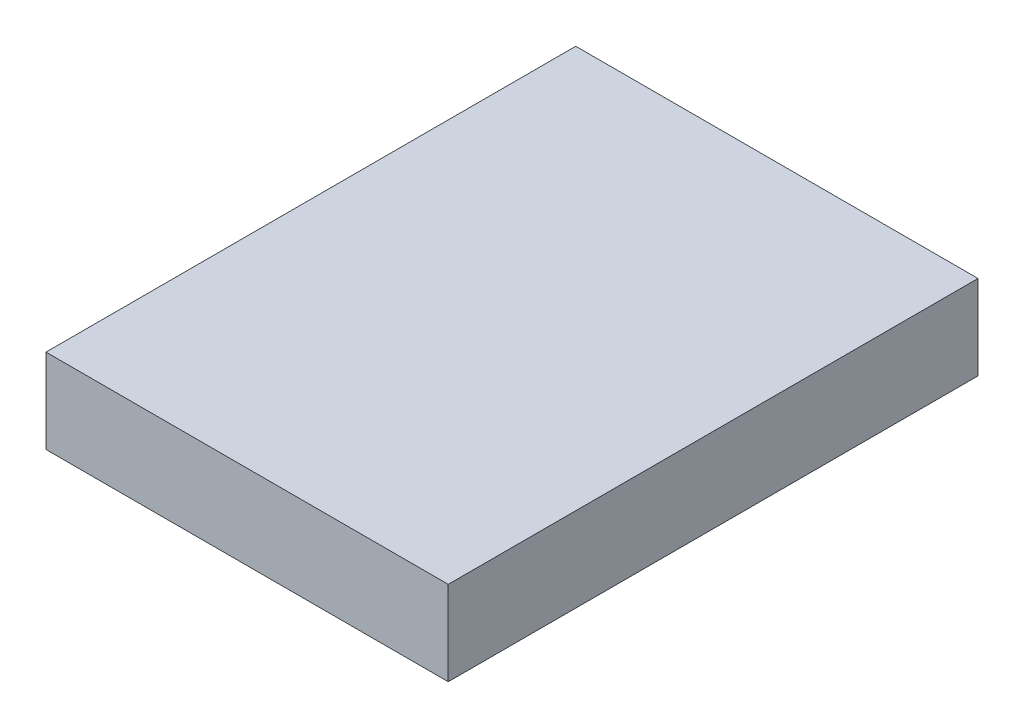
ISO-10303-21;
HEADER;
FILE_DESCRIPTION(('STEP AP214'),'2;1');
FILE_NAME('part.step','',(''),(''),'','','');
FILE_SCHEMA(('AUTOMOTIVE_DESIGN { 1 0 10303 214 1 1 1 1 }'));
ENDSEC;
DATA;
#1=APPLICATION_CONTEXT('core data for automotive mechanical design processes');
#2=APPLICATION_PROTOCOL_DEFINITION('international standard','automotive_design',2000,#1);
#3=PRODUCT_CONTEXT('',#1,'mechanical');
#4=PRODUCT('Part','Part','',(#3));
#5=PRODUCT_RELATED_PRODUCT_CATEGORY('part','',(#4));
#6=PRODUCT_DEFINITION_FORMATION('','',#4);
#7=PRODUCT_DEFINITION_CONTEXT('part definition',#1,'design');
#8=PRODUCT_DEFINITION('design','',#6,#7);
#9=PRODUCT_DEFINITION_SHAPE('','',#8);
#10=(LENGTH_UNIT() NAMED_UNIT(*) SI_UNIT(.MILLI.,.METRE.));
#11=(NAMED_UNIT(*) PLANE_ANGLE_UNIT() SI_UNIT($,.RADIAN.));
#12=(NAMED_UNIT(*) SI_UNIT($,.STERADIAN.) SOLID_ANGLE_UNIT());
#13=UNCERTAINTY_MEASURE_WITH_UNIT(LENGTH_MEASURE(1.E-05),#10,'distance_accuracy_value','');
#14=(GEOMETRIC_REPRESENTATION_CONTEXT(3) GLOBAL_UNCERTAINTY_ASSIGNED_CONTEXT((#13)) GLOBAL_UNIT_ASSIGNED_CONTEXT((#10,
#11,#12)) REPRESENTATION_CONTEXT('',''));
#15=CARTESIAN_POINT('',(0.,0.,0.));
#16=DIRECTION('',(0.,0.,1.));
#17=DIRECTION('',(1.,0.,0.));
#18=AXIS2_PLACEMENT_3D('',#15,#16,#17);
#19=CARTESIAN_POINT('',(10.25,4.3,13.5));
#20=DIRECTION('',(-1.,0.,0.));
#21=DIRECTION('',(0.,0.,1.));
#22=AXIS2_PLACEMENT_3D('',#19,#20,#21);
#23=PLANE('',#22);
#24=DIRECTION('',(0.,0.,-1.));
#25=VECTOR('',#24,1.);
#26=CARTESIAN_POINT('',(10.25,0.,13.5));
#27=LINE('',#26,#25);
#28=CARTESIAN_POINT('',(10.25,0.,13.5));
#29=VERTEX_POINT('',#28);
#30=CARTESIAN_POINT('',(10.25,0.,-13.5));
#31=VERTEX_POINT('',#30);
#32=EDGE_CURVE('E100',#29,#31,#27,.T.);
#33=ORIENTED_EDGE('',*,*,#32,.T.);
#34=DIRECTION('',(0.,-1.,0.));
#35=VECTOR('',#34,1.);
#36=CARTESIAN_POINT('',(10.25,4.3,-13.5));
#37=LINE('',#36,#35);
#38=CARTESIAN_POINT('',(10.25,4.3,-13.5));
#39=VERTEX_POINT('',#38);
#40=EDGE_CURVE('E11',#39,#31,#37,.T.);
#41=ORIENTED_EDGE('',*,*,#40,.F.);
#42=DIRECTION('',(0.,0.,-1.));
#43=VECTOR('',#42,1.);
#44=CARTESIAN_POINT('',(10.25,4.3,13.5));
#45=LINE('',#44,#43);
#46=CARTESIAN_POINT('',(10.25,4.3,13.5));
#47=VERTEX_POINT('',#46);
#48=EDGE_CURVE('E88',#47,#39,#45,.T.);
#49=ORIENTED_EDGE('',*,*,#48,.F.);
#50=DIRECTION('',(0.,-1.,0.));
#51=VECTOR('',#50,1.);
#52=CARTESIAN_POINT('',(10.25,4.3,13.5));
#53=LINE('',#52,#51);
#54=EDGE_CURVE('E96',#47,#29,#53,.T.);
#55=ORIENTED_EDGE('',*,*,#54,.T.);
#56=EDGE_LOOP('',(#33,#41,#49,#55));
#57=FACE_BOUND('',#56,.T.);
#58=ADVANCED_FACE('F37',(#57),#23,.F.);
#59=CARTESIAN_POINT('',(-10.25,4.3,-13.5));
#60=DIRECTION('',(0.,0.,1.));
#61=DIRECTION('',(1.,0.,0.));
#62=AXIS2_PLACEMENT_3D('',#59,#60,#61);
#63=PLANE('',#62);
#64=DIRECTION('',(-1.,0.,0.));
#65=VECTOR('',#64,1.);
#66=CARTESIAN_POINT('',(-10.25,0.,-13.5));
#67=LINE('',#66,#65);
#68=CARTESIAN_POINT('',(-10.25,0.,-13.5));
#69=VERTEX_POINT('',#68);
#70=EDGE_CURVE('E92',#31,#69,#67,.T.);
#71=ORIENTED_EDGE('',*,*,#70,.T.);
#72=DIRECTION('',(0.,-1.,0.));
#73=VECTOR('',#72,1.);
#74=CARTESIAN_POINT('',(-10.25,4.3,-13.5));
#75=LINE('',#74,#73);
#76=CARTESIAN_POINT('',(-10.25,4.3,-13.5));
#77=VERTEX_POINT('',#76);
#78=EDGE_CURVE('E45',#77,#69,#75,.T.);
#79=ORIENTED_EDGE('',*,*,#78,.F.);
#80=DIRECTION('',(-1.,0.,0.));
#81=VECTOR('',#80,1.);
#82=CARTESIAN_POINT('',(-10.25,4.3,-13.5));
#83=LINE('',#82,#81);
#84=EDGE_CURVE('E83',#39,#77,#83,.T.);
#85=ORIENTED_EDGE('',*,*,#84,.F.);
#86=ORIENTED_EDGE('',*,*,#40,.T.);
#87=EDGE_LOOP('',(#71,#79,#85,#86));
#88=FACE_BOUND('',#87,.T.);
#89=ADVANCED_FACE('F91',(#88),#63,.F.);
#90=CARTESIAN_POINT('',(-10.25,4.3,13.5));
#91=DIRECTION('',(1.,0.,0.));
#92=DIRECTION('',(0.,0.,-1.));
#93=AXIS2_PLACEMENT_3D('',#90,#91,#92);
#94=PLANE('',#93);
#95=DIRECTION('',(0.,0.,1.));
#96=VECTOR('',#95,1.);
#97=CARTESIAN_POINT('',(-10.25,0.,13.5));
#98=LINE('',#97,#96);
#99=CARTESIAN_POINT('',(-10.25,0.,13.5));
#100=VERTEX_POINT('',#99);
#101=EDGE_CURVE('E70',#69,#100,#98,.T.);
#102=ORIENTED_EDGE('',*,*,#101,.T.);
#103=DIRECTION('',(0.,-1.,0.));
#104=VECTOR('',#103,1.);
#105=CARTESIAN_POINT('',(-10.25,4.3,13.5));
#106=LINE('',#105,#104);
#107=CARTESIAN_POINT('',(-10.25,4.3,13.5));
#108=VERTEX_POINT('',#107);
#109=EDGE_CURVE('E93',#108,#100,#106,.T.);
#110=ORIENTED_EDGE('',*,*,#109,.F.);
#111=DIRECTION('',(0.,0.,1.));
#112=VECTOR('',#111,1.);
#113=CARTESIAN_POINT('',(-10.25,4.3,13.5));
#114=LINE('',#113,#112);
#115=EDGE_CURVE('E86',#77,#108,#114,.T.);
#116=ORIENTED_EDGE('',*,*,#115,.F.);
#117=ORIENTED_EDGE('',*,*,#78,.T.);
#118=EDGE_LOOP('',(#102,#110,#116,#117));
#119=FACE_BOUND('',#118,.T.);
#120=ADVANCED_FACE('F94',(#119),#94,.F.);
#121=CARTESIAN_POINT('',(-10.25,4.3,13.5));
#122=DIRECTION('',(0.,0.,-1.));
#123=DIRECTION('',(-1.,0.,0.));
#124=AXIS2_PLACEMENT_3D('',#121,#122,#123);
#125=PLANE('',#124);
#126=DIRECTION('',(1.,0.,0.));
#127=VECTOR('',#126,1.);
#128=CARTESIAN_POINT('',(-10.25,0.,13.5));
#129=LINE('',#128,#127);
#130=EDGE_CURVE('E76',#100,#29,#129,.T.);
#131=ORIENTED_EDGE('',*,*,#130,.T.);
#132=ORIENTED_EDGE('',*,*,#54,.F.);
#133=DIRECTION('',(1.,0.,0.));
#134=VECTOR('',#133,1.);
#135=CARTESIAN_POINT('',(-10.25,4.3,13.5));
#136=LINE('',#135,#134);
#137=EDGE_CURVE('E53',#108,#47,#136,.T.);
#138=ORIENTED_EDGE('',*,*,#137,.F.);
#139=ORIENTED_EDGE('',*,*,#109,.T.);
#140=EDGE_LOOP('',(#131,#132,#138,#139));
#141=FACE_BOUND('',#140,.T.);
#142=ADVANCED_FACE('F107',(#141),#125,.F.);
#143=CARTESIAN_POINT('',(0.,4.3,0.));
#144=DIRECTION('',(0.,-1.,0.));
#145=DIRECTION('',(0.,0.,-1.));
#146=AXIS2_PLACEMENT_3D('',#143,#144,#145);
#147=PLANE('',#146);
#148=ORIENTED_EDGE('',*,*,#48,.T.);
#149=ORIENTED_EDGE('',*,*,#84,.T.);
#150=ORIENTED_EDGE('',*,*,#115,.T.);
#151=ORIENTED_EDGE('',*,*,#137,.T.);
#152=EDGE_LOOP('',(#148,#149,#150,#151));
#153=FACE_BOUND('',#152,.T.);
#154=ADVANCED_FACE('F84',(#153),#147,.F.);
#155=CARTESIAN_POINT('',(0.,0.,0.));
#156=DIRECTION('',(0.,-1.,0.));
#157=DIRECTION('',(0.,0.,-1.));
#158=AXIS2_PLACEMENT_3D('',#155,#156,#157);
#159=PLANE('',#158);
#160=ORIENTED_EDGE('',*,*,#32,.F.);
#161=ORIENTED_EDGE('',*,*,#130,.F.);
#162=ORIENTED_EDGE('',*,*,#101,.F.);
#163=ORIENTED_EDGE('',*,*,#70,.F.);
#164=EDGE_LOOP('',(#160,#161,#162,#163));
#165=FACE_BOUND('',#164,.T.);
#166=ADVANCED_FACE('F110',(#165),#159,.T.);
#167=CLOSED_SHELL('',(#58,#89,#120,#142,#154,#166));
#168=MANIFOLD_SOLID_BREP('B2',#167);
#169=ADVANCED_BREP_SHAPE_REPRESENTATION('',(#18,#168),#14);
#170=SHAPE_DEFINITION_REPRESENTATION(#9,#169);
ENDSEC;
END-ISO-10303-21;
